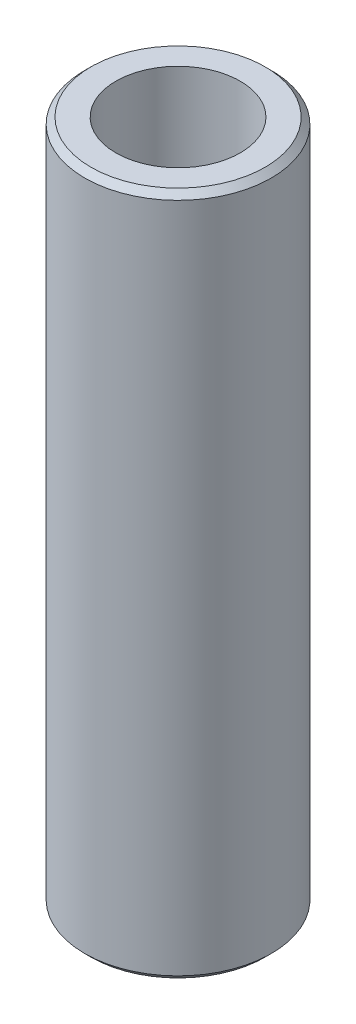
ISO-10303-21;
HEADER;
FILE_DESCRIPTION(('STEP AP214'),'2;1');
FILE_NAME('part.step','',(''),(''),'','','');
FILE_SCHEMA(('AUTOMOTIVE_DESIGN { 1 0 10303 214 1 1 1 1 }'));
ENDSEC;
DATA;
#1=APPLICATION_CONTEXT('core data for automotive mechanical design processes');
#2=APPLICATION_PROTOCOL_DEFINITION('international standard','automotive_design',2000,#1);
#3=PRODUCT_CONTEXT('',#1,'mechanical');
#4=PRODUCT('Part','Part','',(#3));
#5=PRODUCT_RELATED_PRODUCT_CATEGORY('part','',(#4));
#6=PRODUCT_DEFINITION_FORMATION('','',#4);
#7=PRODUCT_DEFINITION_CONTEXT('part definition',#1,'design');
#8=PRODUCT_DEFINITION('design','',#6,#7);
#9=PRODUCT_DEFINITION_SHAPE('','',#8);
#10=(LENGTH_UNIT() NAMED_UNIT(*) SI_UNIT(.MILLI.,.METRE.));
#11=(NAMED_UNIT(*) PLANE_ANGLE_UNIT() SI_UNIT($,.RADIAN.));
#12=(NAMED_UNIT(*) SI_UNIT($,.STERADIAN.) SOLID_ANGLE_UNIT());
#13=UNCERTAINTY_MEASURE_WITH_UNIT(LENGTH_MEASURE(1.E-05),#10,'distance_accuracy_value','');
#14=(GEOMETRIC_REPRESENTATION_CONTEXT(3) GLOBAL_UNCERTAINTY_ASSIGNED_CONTEXT((#13)) GLOBAL_UNIT_ASSIGNED_CONTEXT((#10,
#11,#12)) REPRESENTATION_CONTEXT('',''));
#15=CARTESIAN_POINT('',(0.,0.,0.));
#16=DIRECTION('',(0.,0.,1.));
#17=DIRECTION('',(1.,0.,0.));
#18=AXIS2_PLACEMENT_3D('',#15,#16,#17);
#19=CARTESIAN_POINT('',(0.,55.,0.));
#20=DIRECTION('',(0.,1.,0.));
#21=DIRECTION('',(0.,0.,1.));
#22=AXIS2_PLACEMENT_3D('',#19,#20,#21);
#23=PLANE('',#22);
#24=CARTESIAN_POINT('',(0.,55.,0.));
#25=DIRECTION('',(0.,1.,0.));
#26=DIRECTION('',(0.,0.,1.));
#27=AXIS2_PLACEMENT_3D('',#24,#25,#26);
#28=CIRCLE('',#27,7.00000000000001);
#29=CARTESIAN_POINT('',(0.,55.,7.00000000000001));
#30=VERTEX_POINT('',#29);
#31=EDGE_CURVE('E10',#30,#30,#28,.T.);
#32=ORIENTED_EDGE('',*,*,#31,.T.);
#33=EDGE_LOOP('',(#32));
#34=FACE_BOUND('',#33,.T.);
#35=CARTESIAN_POINT('',(0.,55.,0.));
#36=DIRECTION('',(0.,1.,0.));
#37=DIRECTION('',(0.,0.,1.));
#38=AXIS2_PLACEMENT_3D('',#35,#36,#37);
#39=CIRCLE('',#38,5.);
#40=CARTESIAN_POINT('',(0.,55.,5.));
#41=VERTEX_POINT('',#40);
#42=EDGE_CURVE('E66',#41,#41,#39,.T.);
#43=ORIENTED_EDGE('',*,*,#42,.F.);
#44=EDGE_LOOP('',(#43));
#45=FACE_BOUND('',#44,.T.);
#46=ADVANCED_FACE('F41',(#34,#45),#23,.T.);
#47=CARTESIAN_POINT('',(0.,0.,0.));
#48=DIRECTION('',(0.,1.,0.));
#49=DIRECTION('',(0.,0.,1.));
#50=AXIS2_PLACEMENT_3D('',#47,#48,#49);
#51=PLANE('',#50);
#52=CARTESIAN_POINT('',(0.,0.,0.));
#53=DIRECTION('',(0.,1.,0.));
#54=DIRECTION('',(0.,0.,1.));
#55=AXIS2_PLACEMENT_3D('',#52,#53,#54);
#56=CIRCLE('',#55,7.);
#57=CARTESIAN_POINT('',(0.,0.,7.));
#58=VERTEX_POINT('',#57);
#59=EDGE_CURVE('E50',#58,#58,#56,.F.);
#60=ORIENTED_EDGE('',*,*,#59,.T.);
#61=EDGE_LOOP('',(#60));
#62=FACE_BOUND('',#61,.T.);
#63=CARTESIAN_POINT('',(0.,0.,0.));
#64=DIRECTION('',(0.,1.,0.));
#65=DIRECTION('',(0.,0.,1.));
#66=AXIS2_PLACEMENT_3D('',#63,#64,#65);
#67=CIRCLE('',#66,5.);
#68=CARTESIAN_POINT('',(0.,0.,5.));
#69=VERTEX_POINT('',#68);
#70=EDGE_CURVE('E67',#69,#69,#67,.T.);
#71=ORIENTED_EDGE('',*,*,#70,.T.);
#72=EDGE_LOOP('',(#71));
#73=FACE_BOUND('',#72,.T.);
#74=ADVANCED_FACE('F79',(#62,#73),#51,.F.);
#75=CARTESIAN_POINT('',(0.,55.,0.));
#76=DIRECTION('',(0.,-1.,0.));
#77=DIRECTION('',(0.,0.,-1.));
#78=AXIS2_PLACEMENT_3D('',#75,#76,#77);
#79=CYLINDRICAL_SURFACE('',#78,7.5);
#80=CARTESIAN_POINT('',(0.,0.5,0.));
#81=DIRECTION('',(0.,1.,0.));
#82=DIRECTION('',(0.,0.,1.));
#83=AXIS2_PLACEMENT_3D('',#80,#81,#82);
#84=CIRCLE('',#83,7.5);
#85=CARTESIAN_POINT('',(0.,0.5,7.5));
#86=VERTEX_POINT('',#85);
#87=EDGE_CURVE('E55',#86,#86,#84,.T.);
#88=ORIENTED_EDGE('',*,*,#87,.T.);
#89=EDGE_LOOP('',(#88));
#90=FACE_BOUND('',#89,.T.);
#91=CARTESIAN_POINT('',(0.,54.5,0.));
#92=DIRECTION('',(0.,1.,0.));
#93=DIRECTION('',(0.,0.,1.));
#94=AXIS2_PLACEMENT_3D('',#91,#92,#93);
#95=CIRCLE('',#94,7.5);
#96=CARTESIAN_POINT('',(0.,54.5,7.5));
#97=VERTEX_POINT('',#96);
#98=EDGE_CURVE('E60',#97,#97,#95,.F.);
#99=ORIENTED_EDGE('',*,*,#98,.T.);
#100=EDGE_LOOP('',(#99));
#101=FACE_BOUND('',#100,.T.);
#102=ADVANCED_FACE('F84',(#90,#101),#79,.T.);
#103=CARTESIAN_POINT('',(0.,55.,0.));
#104=DIRECTION('',(0.,-1.,0.));
#105=DIRECTION('',(0.,0.,-1.));
#106=AXIS2_PLACEMENT_3D('',#103,#104,#105);
#107=CYLINDRICAL_SURFACE('',#106,5.);
#108=ORIENTED_EDGE('',*,*,#42,.T.);
#109=EDGE_LOOP('',(#108));
#110=FACE_BOUND('',#109,.T.);
#111=ORIENTED_EDGE('',*,*,#70,.F.);
#112=EDGE_LOOP('',(#111));
#113=FACE_BOUND('',#112,.T.);
#114=ADVANCED_FACE('F75',(#110,#113),#107,.F.);
#115=CARTESIAN_POINT('',(0.,0.5,0.));
#116=DIRECTION('',(0.,1.,0.));
#117=DIRECTION('',(0.,0.,1.));
#118=AXIS2_PLACEMENT_3D('',#115,#116,#117);
#119=CONICAL_SURFACE('',#118,7.5,0.785398163397447);
#120=ORIENTED_EDGE('',*,*,#59,.F.);
#121=EDGE_LOOP('',(#120));
#122=FACE_BOUND('',#121,.T.);
#123=ORIENTED_EDGE('',*,*,#87,.F.);
#124=EDGE_LOOP('',(#123));
#125=FACE_BOUND('',#124,.T.);
#126=ADVANCED_FACE('F91',(#122,#125),#119,.T.);
#127=CARTESIAN_POINT('',(0.,55.,0.));
#128=DIRECTION('',(0.,-1.,0.));
#129=DIRECTION('',(0.,0.,-1.));
#130=AXIS2_PLACEMENT_3D('',#127,#128,#129);
#131=CONICAL_SURFACE('',#130,7.00000000000001,0.785398163397442);
#132=ORIENTED_EDGE('',*,*,#98,.F.);
#133=EDGE_LOOP('',(#132));
#134=FACE_BOUND('',#133,.T.);
#135=ORIENTED_EDGE('',*,*,#31,.F.);
#136=EDGE_LOOP('',(#135));
#137=FACE_BOUND('',#136,.T.);
#138=ADVANCED_FACE('F44',(#134,#137),#131,.T.);
#139=CLOSED_SHELL('',(#46,#74,#102,#114,#126,#138));
#140=MANIFOLD_SOLID_BREP('B2',#139);
#141=ADVANCED_BREP_SHAPE_REPRESENTATION('',(#18,#140),#14);
#142=SHAPE_DEFINITION_REPRESENTATION(#9,#141);
ENDSEC;
END-ISO-10303-21;
